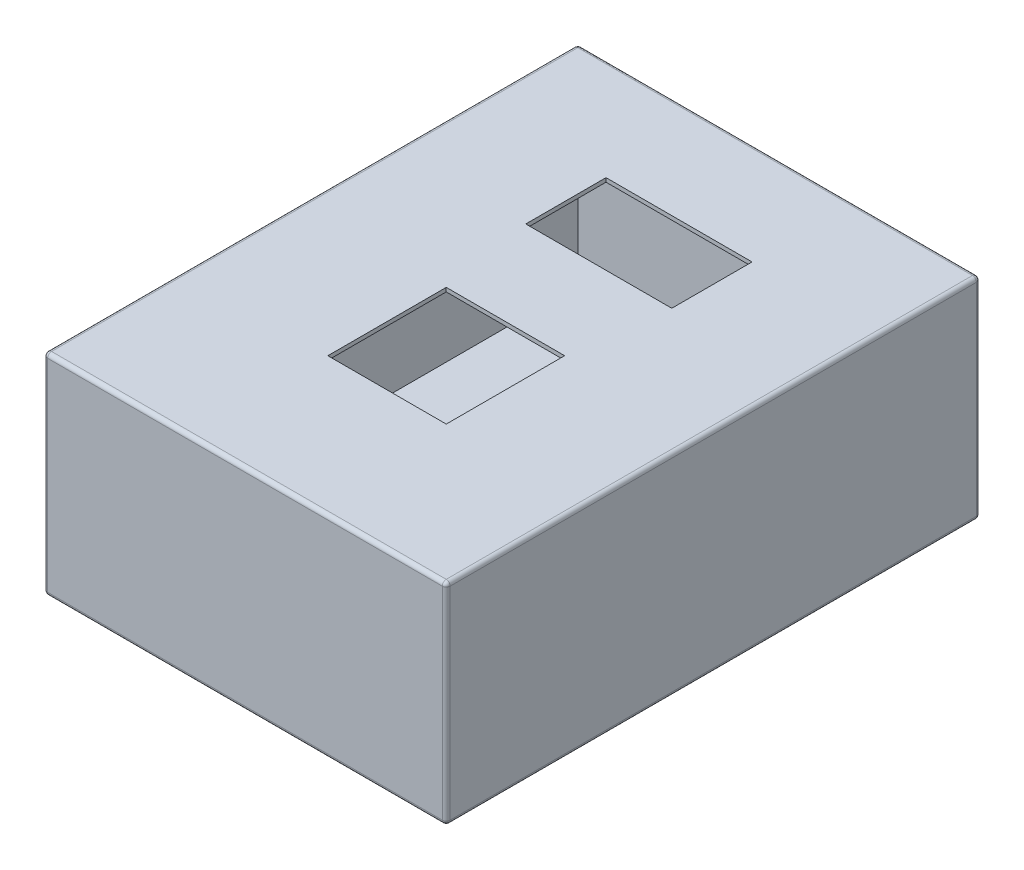
ISO-10303-21;
HEADER;
FILE_DESCRIPTION(('STEP AP214'),'2;1');
FILE_NAME('part.step','',(''),(''),'','','');
FILE_SCHEMA(('AUTOMOTIVE_DESIGN { 1 0 10303 214 1 1 1 1 }'));
ENDSEC;
DATA;
#1=APPLICATION_CONTEXT('core data for automotive mechanical design processes');
#2=APPLICATION_PROTOCOL_DEFINITION('international standard','automotive_design',2000,#1);
#3=PRODUCT_CONTEXT('',#1,'mechanical');
#4=PRODUCT('Part','Part','',(#3));
#5=PRODUCT_RELATED_PRODUCT_CATEGORY('part','',(#4));
#6=PRODUCT_DEFINITION_FORMATION('','',#4);
#7=PRODUCT_DEFINITION_CONTEXT('part definition',#1,'design');
#8=PRODUCT_DEFINITION('design','',#6,#7);
#9=PRODUCT_DEFINITION_SHAPE('','',#8);
#10=(LENGTH_UNIT() NAMED_UNIT(*) SI_UNIT(.MILLI.,.METRE.));
#11=(NAMED_UNIT(*) PLANE_ANGLE_UNIT() SI_UNIT($,.RADIAN.));
#12=(NAMED_UNIT(*) SI_UNIT($,.STERADIAN.) SOLID_ANGLE_UNIT());
#13=UNCERTAINTY_MEASURE_WITH_UNIT(LENGTH_MEASURE(1.E-05),#10,'distance_accuracy_value','');
#14=(GEOMETRIC_REPRESENTATION_CONTEXT(3) GLOBAL_UNCERTAINTY_ASSIGNED_CONTEXT((#13)) GLOBAL_UNIT_ASSIGNED_CONTEXT((#10,
#11,#12)) REPRESENTATION_CONTEXT('',''));
#15=CARTESIAN_POINT('',(0.,0.,0.));
#16=DIRECTION('',(0.,0.,1.));
#17=DIRECTION('',(1.,0.,0.));
#18=AXIS2_PLACEMENT_3D('',#15,#16,#17);
#19=CARTESIAN_POINT('',(1941.20140895498,157.,2493.15201015672));
#20=DIRECTION('',(1.,0.,0.));
#21=DIRECTION('',(0.,0.,-1.));
#22=AXIS2_PLACEMENT_3D('',#19,#20,#21);
#23=PLANE('',#22);
#24=DIRECTION('',(0.,0.,1.));
#25=VECTOR('',#24,1.);
#26=CARTESIAN_POINT('',(1941.20140895498,3.,2493.15201015672));
#27=LINE('',#26,#25);
#28=CARTESIAN_POINT('',(1941.20140895498,3.,2493.15201015672));
#29=VERTEX_POINT('',#28);
#30=CARTESIAN_POINT('',(1941.20140895498,3.,2893.15201015672));
#31=VERTEX_POINT('',#30);
#32=EDGE_CURVE('E284',#29,#31,#27,.T.);
#33=ORIENTED_EDGE('',*,*,#32,.F.);
#34=DIRECTION('',(0.,-1.,0.));
#35=VECTOR('',#34,1.);
#36=CARTESIAN_POINT('',(1941.20140895498,157.,2493.15201015672));
#37=LINE('',#36,#35);
#38=CARTESIAN_POINT('',(1941.20140895498,157.,2493.15201015672));
#39=VERTEX_POINT('',#38);
#40=EDGE_CURVE('E299',#39,#29,#37,.T.);
#41=ORIENTED_EDGE('',*,*,#40,.F.);
#42=DIRECTION('',(0.,0.,1.));
#43=VECTOR('',#42,1.);
#44=CARTESIAN_POINT('',(1941.20140895498,157.,2493.15201015672));
#45=LINE('',#44,#43);
#46=CARTESIAN_POINT('',(1941.20140895498,157.,2893.15201015672));
#47=VERTEX_POINT('',#46);
#48=EDGE_CURVE('E285',#39,#47,#45,.T.);
#49=ORIENTED_EDGE('',*,*,#48,.T.);
#50=DIRECTION('',(0.,-1.,0.));
#51=VECTOR('',#50,1.);
#52=CARTESIAN_POINT('',(1941.20140895498,157.,2893.15201015672));
#53=LINE('',#52,#51);
#54=EDGE_CURVE('E322',#47,#31,#53,.T.);
#55=ORIENTED_EDGE('',*,*,#54,.T.);
#56=EDGE_LOOP('',(#33,#41,#49,#55));
#57=FACE_BOUND('',#56,.T.);
#58=ADVANCED_FACE('F43',(#57),#23,.T.);
#59=CARTESIAN_POINT('',(1941.20140895498,157.,2893.15201015672));
#60=DIRECTION('',(0.,0.,-1.));
#61=DIRECTION('',(-1.,0.,0.));
#62=AXIS2_PLACEMENT_3D('',#59,#60,#61);
#63=PLANE('',#62);
#64=DIRECTION('',(1.,0.,0.));
#65=VECTOR('',#64,1.);
#66=CARTESIAN_POINT('',(1941.20140895498,3.,2893.15201015672));
#67=LINE('',#66,#65);
#68=CARTESIAN_POINT('',(2241.20140895498,3.,2893.15201015672));
#69=VERTEX_POINT('',#68);
#70=EDGE_CURVE('E303',#31,#69,#67,.T.);
#71=ORIENTED_EDGE('',*,*,#70,.F.);
#72=ORIENTED_EDGE('',*,*,#54,.F.);
#73=DIRECTION('',(1.,0.,0.));
#74=VECTOR('',#73,1.);
#75=CARTESIAN_POINT('',(1941.20140895498,157.,2893.15201015672));
#76=LINE('',#75,#74);
#77=CARTESIAN_POINT('',(2241.20140895498,157.,2893.15201015672));
#78=VERTEX_POINT('',#77);
#79=EDGE_CURVE('E289',#47,#78,#76,.T.);
#80=ORIENTED_EDGE('',*,*,#79,.T.);
#81=DIRECTION('',(0.,-1.,0.));
#82=VECTOR('',#81,1.);
#83=CARTESIAN_POINT('',(2241.20140895498,157.,2893.15201015672));
#84=LINE('',#83,#82);
#85=EDGE_CURVE('E318',#78,#69,#84,.T.);
#86=ORIENTED_EDGE('',*,*,#85,.T.);
#87=EDGE_LOOP('',(#71,#72,#80,#86));
#88=FACE_BOUND('',#87,.T.);
#89=ADVANCED_FACE('F597',(#88),#63,.T.);
#90=CARTESIAN_POINT('',(2241.20140895498,157.,2493.15201015672));
#91=DIRECTION('',(-1.,0.,0.));
#92=DIRECTION('',(0.,0.,1.));
#93=AXIS2_PLACEMENT_3D('',#90,#91,#92);
#94=PLANE('',#93);
#95=DIRECTION('',(0.,0.,-1.));
#96=VECTOR('',#95,1.);
#97=CARTESIAN_POINT('',(2241.20140895498,3.,2493.15201015672));
#98=LINE('',#97,#96);
#99=CARTESIAN_POINT('',(2241.20140895498,3.,2493.15201015672));
#100=VERTEX_POINT('',#99);
#101=EDGE_CURVE('E306',#69,#100,#98,.T.);
#102=ORIENTED_EDGE('',*,*,#101,.F.);
#103=ORIENTED_EDGE('',*,*,#85,.F.);
#104=DIRECTION('',(0.,0.,-1.));
#105=VECTOR('',#104,1.);
#106=CARTESIAN_POINT('',(2241.20140895498,157.,2493.15201015672));
#107=LINE('',#106,#105);
#108=CARTESIAN_POINT('',(2241.20140895498,157.,2493.15201015672));
#109=VERTEX_POINT('',#108);
#110=EDGE_CURVE('E293',#78,#109,#107,.T.);
#111=ORIENTED_EDGE('',*,*,#110,.T.);
#112=DIRECTION('',(0.,-1.,0.));
#113=VECTOR('',#112,1.);
#114=CARTESIAN_POINT('',(2241.20140895498,157.,2493.15201015672));
#115=LINE('',#114,#113);
#116=EDGE_CURVE('E314',#109,#100,#115,.T.);
#117=ORIENTED_EDGE('',*,*,#116,.T.);
#118=EDGE_LOOP('',(#102,#103,#111,#117));
#119=FACE_BOUND('',#118,.T.);
#120=ADVANCED_FACE('F603',(#119),#94,.T.);
#121=CARTESIAN_POINT('',(1941.20140895498,157.,2493.15201015672));
#122=DIRECTION('',(0.,0.,1.));
#123=DIRECTION('',(1.,0.,0.));
#124=AXIS2_PLACEMENT_3D('',#121,#122,#123);
#125=PLANE('',#124);
#126=DIRECTION('',(-1.,0.,0.));
#127=VECTOR('',#126,1.);
#128=CARTESIAN_POINT('',(1941.20140895498,3.,2493.15201015672));
#129=LINE('',#128,#127);
#130=EDGE_CURVE('E290',#100,#29,#129,.T.);
#131=ORIENTED_EDGE('',*,*,#130,.F.);
#132=ORIENTED_EDGE('',*,*,#116,.F.);
#133=DIRECTION('',(-1.,0.,0.));
#134=VECTOR('',#133,1.);
#135=CARTESIAN_POINT('',(1941.20140895498,157.,2493.15201015672));
#136=LINE('',#135,#134);
#137=EDGE_CURVE('E296',#109,#39,#136,.T.);
#138=ORIENTED_EDGE('',*,*,#137,.T.);
#139=ORIENTED_EDGE('',*,*,#40,.T.);
#140=EDGE_LOOP('',(#131,#132,#138,#139));
#141=FACE_BOUND('',#140,.T.);
#142=ADVANCED_FACE('F872',(#141),#125,.T.);
#143=CARTESIAN_POINT('',(0.,157.,0.));
#144=DIRECTION('',(0.,1.,0.));
#145=DIRECTION('',(0.,0.,1.));
#146=AXIS2_PLACEMENT_3D('',#143,#144,#145);
#147=PLANE('',#146);
#148=DIRECTION('',(-1.,0.,0.));
#149=VECTOR('',#148,1.);
#150=CARTESIAN_POINT('',(0.,157.,2700.94512117278));
#151=LINE('',#150,#149);
#152=CARTESIAN_POINT('',(2139.01111828185,157.,2700.94512117278));
#153=VERTEX_POINT('',#152);
#154=CARTESIAN_POINT('',(2049.01111828185,157.,2700.94512117278));
#155=VERTEX_POINT('',#154);
#156=EDGE_CURVE('E246',#153,#155,#151,.T.);
#157=ORIENTED_EDGE('',*,*,#156,.T.);
#158=DIRECTION('',(0.,0.,1.));
#159=VECTOR('',#158,1.);
#160=CARTESIAN_POINT('',(2049.01111828185,157.,0.));
#161=LINE('',#160,#159);
#162=CARTESIAN_POINT('',(2049.01111828185,157.,2790.94512117278));
#163=VERTEX_POINT('',#162);
#164=EDGE_CURVE('E250',#155,#163,#161,.T.);
#165=ORIENTED_EDGE('',*,*,#164,.T.);
#166=DIRECTION('',(1.,0.,0.));
#167=VECTOR('',#166,1.);
#168=CARTESIAN_POINT('',(0.,157.,2790.94512117278));
#169=LINE('',#168,#167);
#170=CARTESIAN_POINT('',(2139.01111828185,157.,2790.94512117278));
#171=VERTEX_POINT('',#170);
#172=EDGE_CURVE('E237',#163,#171,#169,.T.);
#173=ORIENTED_EDGE('',*,*,#172,.T.);
#174=DIRECTION('',(0.,0.,-1.));
#175=VECTOR('',#174,1.);
#176=CARTESIAN_POINT('',(2139.01111828185,157.,0.));
#177=LINE('',#176,#175);
#178=EDGE_CURVE('E212',#171,#153,#177,.T.);
#179=ORIENTED_EDGE('',*,*,#178,.T.);
#180=EDGE_LOOP('',(#157,#165,#173,#179));
#181=FACE_BOUND('',#180,.T.);
#182=DIRECTION('',(0.,0.,-1.));
#183=VECTOR('',#182,1.);
#184=CARTESIAN_POINT('',(2148.50217899265,157.,0.));
#185=LINE('',#184,#183);
#186=CARTESIAN_POINT('',(2148.50217899265,157.,2628.98312793191));
#187=VERTEX_POINT('',#186);
#188=CARTESIAN_POINT('',(2148.50217899265,157.,2567.98312793191));
#189=VERTEX_POINT('',#188);
#190=EDGE_CURVE('E326',#187,#189,#185,.T.);
#191=ORIENTED_EDGE('',*,*,#190,.T.);
#192=DIRECTION('',(-1.,0.,0.));
#193=VECTOR('',#192,1.);
#194=CARTESIAN_POINT('',(0.,157.,2567.98312793191));
#195=LINE('',#194,#193);
#196=CARTESIAN_POINT('',(2037.50217899265,157.,2567.98312793191));
#197=VERTEX_POINT('',#196);
#198=EDGE_CURVE('E338',#189,#197,#195,.T.);
#199=ORIENTED_EDGE('',*,*,#198,.T.);
#200=DIRECTION('',(0.,0.,1.));
#201=VECTOR('',#200,1.);
#202=CARTESIAN_POINT('',(2037.50217899265,157.,0.));
#203=LINE('',#202,#201);
#204=CARTESIAN_POINT('',(2037.50217899265,157.,2628.98312793191));
#205=VERTEX_POINT('',#204);
#206=EDGE_CURVE('E334',#197,#205,#203,.T.);
#207=ORIENTED_EDGE('',*,*,#206,.T.);
#208=DIRECTION('',(1.,0.,0.));
#209=VECTOR('',#208,1.);
#210=CARTESIAN_POINT('',(0.,157.,2628.98312793191));
#211=LINE('',#210,#209);
#212=EDGE_CURVE('E330',#205,#187,#211,.T.);
#213=ORIENTED_EDGE('',*,*,#212,.T.);
#214=EDGE_LOOP('',(#191,#199,#207,#213));
#215=FACE_BOUND('',#214,.T.);
#216=ORIENTED_EDGE('',*,*,#48,.F.);
#217=ORIENTED_EDGE('',*,*,#137,.F.);
#218=ORIENTED_EDGE('',*,*,#110,.F.);
#219=ORIENTED_EDGE('',*,*,#79,.F.);
#220=EDGE_LOOP('',(#216,#217,#218,#219));
#221=FACE_BOUND('',#220,.T.);
#222=ADVANCED_FACE('F863',(#181,#215,#221),#147,.F.);
#223=CARTESIAN_POINT('',(0.,3.,0.));
#224=DIRECTION('',(0.,1.,0.));
#225=DIRECTION('',(0.,0.,1.));
#226=AXIS2_PLACEMENT_3D('',#223,#224,#225);
#227=PLANE('',#226);
#228=ORIENTED_EDGE('',*,*,#32,.T.);
#229=ORIENTED_EDGE('',*,*,#70,.T.);
#230=ORIENTED_EDGE('',*,*,#101,.T.);
#231=ORIENTED_EDGE('',*,*,#130,.T.);
#232=EDGE_LOOP('',(#228,#229,#230,#231));
#233=FACE_BOUND('',#232,.T.);
#234=ADVANCED_FACE('F854',(#233),#227,.T.);
#235=CARTESIAN_POINT('',(2037.50217899265,165.,2567.98312793191));
#236=DIRECTION('',(0.,0.,-1.));
#237=DIRECTION('',(-1.,0.,0.));
#238=AXIS2_PLACEMENT_3D('',#235,#236,#237);
#239=PLANE('',#238);
#240=DIRECTION('',(-1.,0.,0.));
#241=VECTOR('',#240,1.);
#242=CARTESIAN_POINT('',(0.,160.,2567.98312793191));
#243=LINE('',#242,#241);
#244=CARTESIAN_POINT('',(2148.50217899265,160.,2567.98312793191));
#245=VERTEX_POINT('',#244);
#246=CARTESIAN_POINT('',(2037.50217899265,160.,2567.98312793191));
#247=VERTEX_POINT('',#246);
#248=EDGE_CURVE('E281',#245,#247,#243,.T.);
#249=ORIENTED_EDGE('',*,*,#248,.T.);
#250=DIRECTION('',(0.,-1.,0.));
#251=VECTOR('',#250,1.);
#252=CARTESIAN_POINT('',(2037.50217899265,165.,2567.98312793191));
#253=LINE('',#252,#251);
#254=EDGE_CURVE('E255',#247,#197,#253,.T.);
#255=ORIENTED_EDGE('',*,*,#254,.T.);
#256=ORIENTED_EDGE('',*,*,#198,.F.);
#257=DIRECTION('',(0.,-1.,0.));
#258=VECTOR('',#257,1.);
#259=CARTESIAN_POINT('',(2148.50217899265,165.,2567.98312793191));
#260=LINE('',#259,#258);
#261=EDGE_CURVE('E268',#245,#189,#260,.T.);
#262=ORIENTED_EDGE('',*,*,#261,.F.);
#263=EDGE_LOOP('',(#249,#255,#256,#262));
#264=FACE_BOUND('',#263,.T.);
#265=ADVANCED_FACE('F845',(#264),#239,.F.);
#266=CARTESIAN_POINT('',(2037.50217899265,165.,2628.98312793191));
#267=DIRECTION('',(-1.,0.,0.));
#268=DIRECTION('',(0.,0.,1.));
#269=AXIS2_PLACEMENT_3D('',#266,#267,#268);
#270=PLANE('',#269);
#271=DIRECTION('',(0.,0.,1.));
#272=VECTOR('',#271,1.);
#273=CARTESIAN_POINT('',(2037.50217899265,160.,0.));
#274=LINE('',#273,#272);
#275=CARTESIAN_POINT('',(2037.50217899265,160.,2628.98312793191));
#276=VERTEX_POINT('',#275);
#277=EDGE_CURVE('E278',#247,#276,#274,.T.);
#278=ORIENTED_EDGE('',*,*,#277,.T.);
#279=DIRECTION('',(0.,-1.,0.));
#280=VECTOR('',#279,1.);
#281=CARTESIAN_POINT('',(2037.50217899265,165.,2628.98312793191));
#282=LINE('',#281,#280);
#283=EDGE_CURVE('E260',#276,#205,#282,.T.);
#284=ORIENTED_EDGE('',*,*,#283,.T.);
#285=ORIENTED_EDGE('',*,*,#206,.F.);
#286=ORIENTED_EDGE('',*,*,#254,.F.);
#287=EDGE_LOOP('',(#278,#284,#285,#286));
#288=FACE_BOUND('',#287,.T.);
#289=ADVANCED_FACE('F836',(#288),#270,.F.);
#290=CARTESIAN_POINT('',(2148.50217899265,165.,2628.98312793191));
#291=DIRECTION('',(0.,0.,1.));
#292=DIRECTION('',(1.,0.,0.));
#293=AXIS2_PLACEMENT_3D('',#290,#291,#292);
#294=PLANE('',#293);
#295=DIRECTION('',(1.,0.,0.));
#296=VECTOR('',#295,1.);
#297=CARTESIAN_POINT('',(0.,160.,2628.98312793191));
#298=LINE('',#297,#296);
#299=CARTESIAN_POINT('',(2148.50217899265,160.,2628.98312793191));
#300=VERTEX_POINT('',#299);
#301=EDGE_CURVE('E274',#276,#300,#298,.T.);
#302=ORIENTED_EDGE('',*,*,#301,.T.);
#303=DIRECTION('',(0.,-1.,0.));
#304=VECTOR('',#303,1.);
#305=CARTESIAN_POINT('',(2148.50217899265,165.,2628.98312793191));
#306=LINE('',#305,#304);
#307=EDGE_CURVE('E264',#300,#187,#306,.T.);
#308=ORIENTED_EDGE('',*,*,#307,.T.);
#309=ORIENTED_EDGE('',*,*,#212,.F.);
#310=ORIENTED_EDGE('',*,*,#283,.F.);
#311=EDGE_LOOP('',(#302,#308,#309,#310));
#312=FACE_BOUND('',#311,.T.);
#313=ADVANCED_FACE('F827',(#312),#294,.F.);
#314=CARTESIAN_POINT('',(2148.50217899265,165.,2567.98312793191));
#315=DIRECTION('',(1.,0.,0.));
#316=DIRECTION('',(0.,0.,-1.));
#317=AXIS2_PLACEMENT_3D('',#314,#315,#316);
#318=PLANE('',#317);
#319=DIRECTION('',(0.,0.,-1.));
#320=VECTOR('',#319,1.);
#321=CARTESIAN_POINT('',(2148.50217899265,160.,0.));
#322=LINE('',#321,#320);
#323=EDGE_CURVE('E259',#300,#245,#322,.T.);
#324=ORIENTED_EDGE('',*,*,#323,.T.);
#325=ORIENTED_EDGE('',*,*,#261,.T.);
#326=ORIENTED_EDGE('',*,*,#190,.F.);
#327=ORIENTED_EDGE('',*,*,#307,.F.);
#328=EDGE_LOOP('',(#324,#325,#326,#327));
#329=FACE_BOUND('',#328,.T.);
#330=ADVANCED_FACE('F623',(#329),#318,.F.);
#331=CARTESIAN_POINT('',(1938.20140895498,160.,2493.15201015672));
#332=DIRECTION('',(1.,0.,0.));
#333=DIRECTION('',(0.,0.,-1.));
#334=AXIS2_PLACEMENT_3D('',#331,#332,#333);
#335=PLANE('',#334);
#336=DIRECTION('',(0.,-1.,0.));
#337=VECTOR('',#336,1.);
#338=CARTESIAN_POINT('',(1938.20140895498,160.,2493.15201015672));
#339=LINE('',#338,#337);
#340=CARTESIAN_POINT('',(1938.20140895498,157.,2493.15201015672));
#341=VERTEX_POINT('',#340);
#342=CARTESIAN_POINT('',(1938.20140895498,3.,2493.15201015672));
#343=VERTEX_POINT('',#342);
#344=EDGE_CURVE('E357',#341,#343,#339,.T.);
#345=ORIENTED_EDGE('',*,*,#344,.T.);
#346=DIRECTION('',(0.,0.,1.));
#347=VECTOR('',#346,1.);
#348=CARTESIAN_POINT('',(1938.20140895498,3.,2493.15201015672));
#349=LINE('',#348,#347);
#350=CARTESIAN_POINT('',(1938.20140895498,3.,2893.15201015672));
#351=VERTEX_POINT('',#350);
#352=EDGE_CURVE('E411',#343,#351,#349,.T.);
#353=ORIENTED_EDGE('',*,*,#352,.T.);
#354=DIRECTION('',(0.,-1.,0.));
#355=VECTOR('',#354,1.);
#356=CARTESIAN_POINT('',(1938.20140895498,160.,2893.15201015672));
#357=LINE('',#356,#355);
#358=CARTESIAN_POINT('',(1938.20140895498,157.,2893.15201015672));
#359=VERTEX_POINT('',#358);
#360=EDGE_CURVE('E361',#351,#359,#357,.F.);
#361=ORIENTED_EDGE('',*,*,#360,.T.);
#362=DIRECTION('',(0.,0.,1.));
#363=VECTOR('',#362,1.);
#364=CARTESIAN_POINT('',(1938.20140895498,157.,2490.15201015672));
#365=LINE('',#364,#363);
#366=EDGE_CURVE('E346',#359,#341,#365,.F.);
#367=ORIENTED_EDGE('',*,*,#366,.T.);
#368=EDGE_LOOP('',(#345,#353,#361,#367));
#369=FACE_BOUND('',#368,.T.);
#370=ADVANCED_FACE('F557',(#369),#335,.F.);
#371=CARTESIAN_POINT('',(1941.20140895498,160.,2896.15201015672));
#372=DIRECTION('',(0.,0.,-1.));
#373=DIRECTION('',(-1.,0.,0.));
#374=AXIS2_PLACEMENT_3D('',#371,#372,#373);
#375=PLANE('',#374);
#376=DIRECTION('',(0.,-1.,0.));
#377=VECTOR('',#376,1.);
#378=CARTESIAN_POINT('',(1941.20140895498,160.,2896.15201015672));
#379=LINE('',#378,#377);
#380=CARTESIAN_POINT('',(1941.20140895498,157.,2896.15201015672));
#381=VERTEX_POINT('',#380);
#382=CARTESIAN_POINT('',(1941.20140895498,3.,2896.15201015672));
#383=VERTEX_POINT('',#382);
#384=EDGE_CURVE('E353',#381,#383,#379,.T.);
#385=ORIENTED_EDGE('',*,*,#384,.T.);
#386=DIRECTION('',(1.,0.,0.));
#387=VECTOR('',#386,1.);
#388=CARTESIAN_POINT('',(1941.20140895498,3.,2896.15201015672));
#389=LINE('',#388,#387);
#390=CARTESIAN_POINT('',(2241.20140895498,3.,2896.15201015672));
#391=VERTEX_POINT('',#390);
#392=EDGE_CURVE('E451',#383,#391,#389,.T.);
#393=ORIENTED_EDGE('',*,*,#392,.T.);
#394=DIRECTION('',(0.,-1.,0.));
#395=VECTOR('',#394,1.);
#396=CARTESIAN_POINT('',(2241.20140895498,160.,2896.15201015672));
#397=LINE('',#396,#395);
#398=CARTESIAN_POINT('',(2241.20140895498,157.,2896.15201015672));
#399=VERTEX_POINT('',#398);
#400=EDGE_CURVE('E448',#391,#399,#397,.F.);
#401=ORIENTED_EDGE('',*,*,#400,.T.);
#402=DIRECTION('',(1.,0.,0.));
#403=VECTOR('',#402,1.);
#404=CARTESIAN_POINT('',(1941.20140895498,157.,2896.15201015672));
#405=LINE('',#404,#403);
#406=EDGE_CURVE('E350',#399,#381,#405,.F.);
#407=ORIENTED_EDGE('',*,*,#406,.T.);
#408=EDGE_LOOP('',(#385,#393,#401,#407));
#409=FACE_BOUND('',#408,.T.);
#410=ADVANCED_FACE('F569',(#409),#375,.F.);
#411=CARTESIAN_POINT('',(2244.20140895498,160.,2493.15201015672));
#412=DIRECTION('',(-1.,0.,0.));
#413=DIRECTION('',(0.,0.,1.));
#414=AXIS2_PLACEMENT_3D('',#411,#412,#413);
#415=PLANE('',#414);
#416=DIRECTION('',(0.,0.,-1.));
#417=VECTOR('',#416,1.);
#418=CARTESIAN_POINT('',(2244.20140895498,3.,2493.15201015672));
#419=LINE('',#418,#417);
#420=CARTESIAN_POINT('',(2244.20140895498,3.,2893.15201015672));
#421=VERTEX_POINT('',#420);
#422=CARTESIAN_POINT('',(2244.20140895498,3.,2493.15201015672));
#423=VERTEX_POINT('',#422);
#424=EDGE_CURVE('E53',#421,#423,#419,.T.);
#425=ORIENTED_EDGE('',*,*,#424,.T.);
#426=DIRECTION('',(0.,-1.,0.));
#427=VECTOR('',#426,1.);
#428=CARTESIAN_POINT('',(2244.20140895498,160.,2493.15201015672));
#429=LINE('',#428,#427);
#430=CARTESIAN_POINT('',(2244.20140895498,157.,2493.15201015672));
#431=VERTEX_POINT('',#430);
#432=EDGE_CURVE('E11',#423,#431,#429,.F.);
#433=ORIENTED_EDGE('',*,*,#432,.T.);
#434=DIRECTION('',(0.,0.,-1.));
#435=VECTOR('',#434,1.);
#436=CARTESIAN_POINT('',(2244.20140895498,157.,2896.15201015672));
#437=LINE('',#436,#435);
#438=CARTESIAN_POINT('',(2244.20140895498,157.,2893.15201015672));
#439=VERTEX_POINT('',#438);
#440=EDGE_CURVE('E388',#431,#439,#437,.F.);
#441=ORIENTED_EDGE('',*,*,#440,.T.);
#442=DIRECTION('',(0.,-1.,0.));
#443=VECTOR('',#442,1.);
#444=CARTESIAN_POINT('',(2244.20140895498,160.,2893.15201015672));
#445=LINE('',#444,#443);
#446=EDGE_CURVE('E454',#439,#421,#445,.T.);
#447=ORIENTED_EDGE('',*,*,#446,.T.);
#448=EDGE_LOOP('',(#425,#433,#441,#447));
#449=FACE_BOUND('',#448,.T.);
#450=ADVANCED_FACE('F615',(#449),#415,.F.);
#451=CARTESIAN_POINT('',(1941.20140895498,160.,2490.15201015672));
#452=DIRECTION('',(0.,0.,1.));
#453=DIRECTION('',(1.,0.,0.));
#454=AXIS2_PLACEMENT_3D('',#451,#452,#453);
#455=PLANE('',#454);
#456=DIRECTION('',(0.,-1.,0.));
#457=VECTOR('',#456,1.);
#458=CARTESIAN_POINT('',(2241.20140895498,160.,2490.15201015672));
#459=LINE('',#458,#457);
#460=CARTESIAN_POINT('',(2241.20140895498,157.,2490.15201015672));
#461=VERTEX_POINT('',#460);
#462=CARTESIAN_POINT('',(2241.20140895498,3.,2490.15201015672));
#463=VERTEX_POINT('',#462);
#464=EDGE_CURVE('E442',#461,#463,#459,.T.);
#465=ORIENTED_EDGE('',*,*,#464,.T.);
#466=DIRECTION('',(-1.,0.,0.));
#467=VECTOR('',#466,1.);
#468=CARTESIAN_POINT('',(1941.20140895498,3.,2490.15201015672));
#469=LINE('',#468,#467);
#470=CARTESIAN_POINT('',(1941.20140895498,3.,2490.15201015672));
#471=VERTEX_POINT('',#470);
#472=EDGE_CURVE('E445',#463,#471,#469,.T.);
#473=ORIENTED_EDGE('',*,*,#472,.T.);
#474=DIRECTION('',(0.,-1.,0.));
#475=VECTOR('',#474,1.);
#476=CARTESIAN_POINT('',(1941.20140895498,160.,2490.15201015672));
#477=LINE('',#476,#475);
#478=CARTESIAN_POINT('',(1941.20140895498,157.,2490.15201015672));
#479=VERTEX_POINT('',#478);
#480=EDGE_CURVE('E374',#471,#479,#477,.F.);
#481=ORIENTED_EDGE('',*,*,#480,.T.);
#482=DIRECTION('',(-1.,0.,0.));
#483=VECTOR('',#482,1.);
#484=CARTESIAN_POINT('',(2244.20140895498,157.,2490.15201015672));
#485=LINE('',#484,#483);
#486=EDGE_CURVE('E370',#479,#461,#485,.F.);
#487=ORIENTED_EDGE('',*,*,#486,.T.);
#488=EDGE_LOOP('',(#465,#473,#481,#487));
#489=FACE_BOUND('',#488,.T.);
#490=ADVANCED_FACE('F537',(#489),#455,.F.);
#491=CARTESIAN_POINT('',(0.,160.,0.));
#492=DIRECTION('',(0.,1.,0.));
#493=DIRECTION('',(0.,0.,1.));
#494=AXIS2_PLACEMENT_3D('',#491,#492,#493);
#495=PLANE('',#494);
#496=DIRECTION('',(0.,0.,1.));
#497=VECTOR('',#496,1.);
#498=CARTESIAN_POINT('',(2049.01111828185,160.,2700.94512117278));
#499=LINE('',#498,#497);
#500=CARTESIAN_POINT('',(2049.01111828185,160.,2700.94512117278));
#501=VERTEX_POINT('',#500);
#502=CARTESIAN_POINT('',(2049.01111828185,160.,2790.94512117278));
#503=VERTEX_POINT('',#502);
#504=EDGE_CURVE('E69',#501,#503,#499,.T.);
#505=ORIENTED_EDGE('',*,*,#504,.F.);
#506=DIRECTION('',(-1.,0.,0.));
#507=VECTOR('',#506,1.);
#508=CARTESIAN_POINT('',(2049.01111828185,160.,2700.94512117278));
#509=LINE('',#508,#507);
#510=CARTESIAN_POINT('',(2139.01111828185,160.,2700.94512117278));
#511=VERTEX_POINT('',#510);
#512=EDGE_CURVE('E227',#511,#501,#509,.T.);
#513=ORIENTED_EDGE('',*,*,#512,.F.);
#514=DIRECTION('',(0.,0.,-1.));
#515=VECTOR('',#514,1.);
#516=CARTESIAN_POINT('',(2139.01111828185,160.,2700.94512117278));
#517=LINE('',#516,#515);
#518=CARTESIAN_POINT('',(2139.01111828185,160.,2790.94512117278));
#519=VERTEX_POINT('',#518);
#520=EDGE_CURVE('E209',#519,#511,#517,.T.);
#521=ORIENTED_EDGE('',*,*,#520,.F.);
#522=DIRECTION('',(1.,0.,0.));
#523=VECTOR('',#522,1.);
#524=CARTESIAN_POINT('',(2049.01111828185,160.,2790.94512117278));
#525=LINE('',#524,#523);
#526=EDGE_CURVE('E219',#503,#519,#525,.T.);
#527=ORIENTED_EDGE('',*,*,#526,.F.);
#528=EDGE_LOOP('',(#505,#513,#521,#527));
#529=FACE_BOUND('',#528,.T.);
#530=ORIENTED_EDGE('',*,*,#248,.F.);
#531=ORIENTED_EDGE('',*,*,#323,.F.);
#532=ORIENTED_EDGE('',*,*,#301,.F.);
#533=ORIENTED_EDGE('',*,*,#277,.F.);
#534=EDGE_LOOP('',(#530,#531,#532,#533));
#535=FACE_BOUND('',#534,.T.);
#536=DIRECTION('',(0.,0.,1.));
#537=VECTOR('',#536,1.);
#538=CARTESIAN_POINT('',(1941.20140895498,160.,2896.15201015672));
#539=LINE('',#538,#537);
#540=CARTESIAN_POINT('',(1941.20140895498,160.,2493.15201015672));
#541=VERTEX_POINT('',#540);
#542=CARTESIAN_POINT('',(1941.20140895498,160.,2893.15201015672));
#543=VERTEX_POINT('',#542);
#544=EDGE_CURVE('E342',#541,#543,#539,.T.);
#545=ORIENTED_EDGE('',*,*,#544,.T.);
#546=DIRECTION('',(1.,0.,0.));
#547=VECTOR('',#546,1.);
#548=CARTESIAN_POINT('',(2244.20140895498,160.,2893.15201015672));
#549=LINE('',#548,#547);
#550=CARTESIAN_POINT('',(2241.20140895498,160.,2893.15201015672));
#551=VERTEX_POINT('',#550);
#552=EDGE_CURVE('E384',#543,#551,#549,.T.);
#553=ORIENTED_EDGE('',*,*,#552,.T.);
#554=DIRECTION('',(0.,0.,-1.));
#555=VECTOR('',#554,1.);
#556=CARTESIAN_POINT('',(2241.20140895498,160.,2490.15201015672));
#557=LINE('',#556,#555);
#558=CARTESIAN_POINT('',(2241.20140895498,160.,2493.15201015672));
#559=VERTEX_POINT('',#558);
#560=EDGE_CURVE('E380',#551,#559,#557,.T.);
#561=ORIENTED_EDGE('',*,*,#560,.T.);
#562=DIRECTION('',(-1.,0.,0.));
#563=VECTOR('',#562,1.);
#564=CARTESIAN_POINT('',(1941.20140895498,160.,2493.15201015672));
#565=LINE('',#564,#563);
#566=EDGE_CURVE('E377',#559,#541,#565,.T.);
#567=ORIENTED_EDGE('',*,*,#566,.T.);
#568=EDGE_LOOP('',(#545,#553,#561,#567));
#569=FACE_BOUND('',#568,.T.);
#570=ADVANCED_FACE('F224',(#529,#535,#569),#495,.T.);
#571=CARTESIAN_POINT('',(0.,0.,0.));
#572=DIRECTION('',(0.,1.,0.));
#573=DIRECTION('',(0.,0.,1.));
#574=AXIS2_PLACEMENT_3D('',#571,#572,#573);
#575=PLANE('',#574);
#576=DIRECTION('',(1.,0.,0.));
#577=VECTOR('',#576,1.);
#578=CARTESIAN_POINT('',(0.,0.,2893.15201015672));
#579=LINE('',#578,#577);
#580=CARTESIAN_POINT('',(2241.20140895498,0.,2893.15201015672));
#581=VERTEX_POINT('',#580);
#582=CARTESIAN_POINT('',(1941.20140895498,0.,2893.15201015672));
#583=VERTEX_POINT('',#582);
#584=EDGE_CURVE('E417',#581,#583,#579,.F.);
#585=ORIENTED_EDGE('',*,*,#584,.T.);
#586=DIRECTION('',(0.,0.,1.));
#587=VECTOR('',#586,1.);
#588=CARTESIAN_POINT('',(1941.20140895498,0.,0.));
#589=LINE('',#588,#587);
#590=CARTESIAN_POINT('',(1941.20140895498,0.,2493.15201015672));
#591=VERTEX_POINT('',#590);
#592=EDGE_CURVE('E423',#583,#591,#589,.F.);
#593=ORIENTED_EDGE('',*,*,#592,.T.);
#594=DIRECTION('',(-1.,0.,0.));
#595=VECTOR('',#594,1.);
#596=CARTESIAN_POINT('',(0.,0.,2493.15201015672));
#597=LINE('',#596,#595);
#598=CARTESIAN_POINT('',(2241.20140895498,0.,2493.15201015672));
#599=VERTEX_POINT('',#598);
#600=EDGE_CURVE('E420',#591,#599,#597,.F.);
#601=ORIENTED_EDGE('',*,*,#600,.T.);
#602=DIRECTION('',(0.,0.,-1.));
#603=VECTOR('',#602,1.);
#604=CARTESIAN_POINT('',(2241.20140895498,0.,2.48823340704416E-12));
#605=LINE('',#604,#603);
#606=EDGE_CURVE('E414',#599,#581,#605,.F.);
#607=ORIENTED_EDGE('',*,*,#606,.T.);
#608=EDGE_LOOP('',(#585,#593,#601,#607));
#609=FACE_BOUND('',#608,.T.);
#610=ADVANCED_FACE('F583',(#609),#575,.F.);
#611=CARTESIAN_POINT('',(1941.20140895498,157.,0.));
#612=DIRECTION('',(0.,0.,-1.));
#613=DIRECTION('',(-1.,0.,0.));
#614=AXIS2_PLACEMENT_3D('',#611,#612,#613);
#615=CYLINDRICAL_SURFACE('',#614,3.);
#616=ORIENTED_EDGE('',*,*,#366,.F.);
#617=CARTESIAN_POINT('',(1941.20140895498,157.,2893.15201015672));
#618=DIRECTION('',(0.,0.,-1.));
#619=DIRECTION('',(-1.,0.,0.));
#620=AXIS2_PLACEMENT_3D('',#617,#618,#619);
#621=CIRCLE('',#620,3.);
#622=EDGE_CURVE('E367',#359,#543,#621,.T.);
#623=ORIENTED_EDGE('',*,*,#622,.T.);
#624=ORIENTED_EDGE('',*,*,#544,.F.);
#625=CARTESIAN_POINT('',(1941.20140895498,157.,2493.15201015672));
#626=DIRECTION('',(0.,0.,-1.));
#627=DIRECTION('',(-1.,0.,0.));
#628=AXIS2_PLACEMENT_3D('',#625,#626,#627);
#629=CIRCLE('',#628,3.);
#630=EDGE_CURVE('E364',#541,#341,#629,.F.);
#631=ORIENTED_EDGE('',*,*,#630,.T.);
#632=EDGE_LOOP('',(#616,#623,#624,#631));
#633=FACE_BOUND('',#632,.T.);
#634=ADVANCED_FACE('F548',(#633),#615,.T.);
#635=CARTESIAN_POINT('',(1941.20140895498,160.,2493.15201015672));
#636=DIRECTION('',(0.,-1.,0.));
#637=DIRECTION('',(0.,0.,-1.));
#638=AXIS2_PLACEMENT_3D('',#635,#636,#637);
#639=CYLINDRICAL_SURFACE('',#638,3.);
#640=ORIENTED_EDGE('',*,*,#480,.F.);
#641=CARTESIAN_POINT('',(1941.20140895498,3.,2493.15201015672));
#642=DIRECTION('',(0.,-1.,0.));
#643=DIRECTION('',(0.,0.,-1.));
#644=AXIS2_PLACEMENT_3D('',#641,#642,#643);
#645=CIRCLE('',#644,3.);
#646=EDGE_CURVE('E392',#471,#343,#645,.F.);
#647=ORIENTED_EDGE('',*,*,#646,.T.);
#648=ORIENTED_EDGE('',*,*,#344,.F.);
#649=CARTESIAN_POINT('',(1941.20140895498,157.,2493.15201015672));
#650=DIRECTION('',(0.,1.,0.));
#651=DIRECTION('',(0.,0.,1.));
#652=AXIS2_PLACEMENT_3D('',#649,#650,#651);
#653=CIRCLE('',#652,3.);
#654=EDGE_CURVE('E271',#479,#341,#653,.T.);
#655=ORIENTED_EDGE('',*,*,#654,.F.);
#656=EDGE_LOOP('',(#640,#647,#648,#655));
#657=FACE_BOUND('',#656,.T.);
#658=ADVANCED_FACE('F554',(#657),#639,.T.);
#659=CARTESIAN_POINT('',(1941.20140895498,157.,2493.15201015672));
#660=DIRECTION('',(0.,0.,1.));
#661=DIRECTION('',(1.,0.,0.));
#662=AXIS2_PLACEMENT_3D('',#659,#660,#661);
#663=SPHERICAL_SURFACE('',#662,3.);
#664=ORIENTED_EDGE('',*,*,#654,.T.);
#665=ORIENTED_EDGE('',*,*,#630,.F.);
#666=CARTESIAN_POINT('',(1941.20140895498,157.,2493.15201015672));
#667=DIRECTION('',(1.,0.,0.));
#668=DIRECTION('',(0.,0.,-1.));
#669=AXIS2_PLACEMENT_3D('',#666,#667,#668);
#670=CIRCLE('',#669,3.);
#671=EDGE_CURVE('E401',#479,#541,#670,.T.);
#672=ORIENTED_EDGE('',*,*,#671,.F.);
#673=EDGE_LOOP('',(#664,#665,#672));
#674=FACE_BOUND('',#673,.T.);
#675=ADVANCED_FACE('F551',(#674),#663,.T.);
#676=CARTESIAN_POINT('',(0.,157.,2493.15201015672));
#677=DIRECTION('',(1.,0.,0.));
#678=DIRECTION('',(0.,0.,-1.));
#679=AXIS2_PLACEMENT_3D('',#676,#677,#678);
#680=CYLINDRICAL_SURFACE('',#679,3.);
#681=ORIENTED_EDGE('',*,*,#566,.F.);
#682=CARTESIAN_POINT('',(2241.20140895498,157.,2493.15201015672));
#683=DIRECTION('',(1.,0.,0.));
#684=DIRECTION('',(0.,0.,-1.));
#685=AXIS2_PLACEMENT_3D('',#682,#683,#684);
#686=CIRCLE('',#685,3.);
#687=EDGE_CURVE('E436',#559,#461,#686,.F.);
#688=ORIENTED_EDGE('',*,*,#687,.T.);
#689=ORIENTED_EDGE('',*,*,#486,.F.);
#690=ORIENTED_EDGE('',*,*,#671,.T.);
#691=EDGE_LOOP('',(#681,#688,#689,#690));
#692=FACE_BOUND('',#691,.T.);
#693=ADVANCED_FACE('F543',(#692),#680,.T.);
#694=CARTESIAN_POINT('',(2241.20140895498,157.,2.48823340704416E-12));
#695=DIRECTION('',(0.,0.,1.));
#696=DIRECTION('',(1.,0.,0.));
#697=AXIS2_PLACEMENT_3D('',#694,#695,#696);
#698=CYLINDRICAL_SURFACE('',#697,3.);
#699=ORIENTED_EDGE('',*,*,#440,.F.);
#700=CARTESIAN_POINT('',(2241.20140895498,157.,2493.15201015672));
#701=DIRECTION('',(0.,0.,1.));
#702=DIRECTION('',(1.,0.,0.));
#703=AXIS2_PLACEMENT_3D('',#700,#701,#702);
#704=CIRCLE('',#703,3.);
#705=EDGE_CURVE('E433',#431,#559,#704,.T.);
#706=ORIENTED_EDGE('',*,*,#705,.T.);
#707=ORIENTED_EDGE('',*,*,#560,.F.);
#708=CARTESIAN_POINT('',(2241.20140895498,157.,2893.15201015672));
#709=DIRECTION('',(0.,0.,1.));
#710=DIRECTION('',(1.,0.,0.));
#711=AXIS2_PLACEMENT_3D('',#708,#709,#710);
#712=CIRCLE('',#711,3.);
#713=EDGE_CURVE('E430',#551,#439,#712,.F.);
#714=ORIENTED_EDGE('',*,*,#713,.T.);
#715=EDGE_LOOP('',(#699,#706,#707,#714));
#716=FACE_BOUND('',#715,.T.);
#717=ADVANCED_FACE('F523',(#716),#698,.T.);
#718=CARTESIAN_POINT('',(0.,157.,2893.15201015672));
#719=DIRECTION('',(-1.,0.,0.));
#720=DIRECTION('',(0.,0.,1.));
#721=AXIS2_PLACEMENT_3D('',#718,#719,#720);
#722=CYLINDRICAL_SURFACE('',#721,3.);
#723=ORIENTED_EDGE('',*,*,#406,.F.);
#724=CARTESIAN_POINT('',(2241.20140895498,157.,2893.15201015672));
#725=DIRECTION('',(-1.,0.,0.));
#726=DIRECTION('',(0.,0.,1.));
#727=AXIS2_PLACEMENT_3D('',#724,#725,#726);
#728=CIRCLE('',#727,3.);
#729=EDGE_CURVE('E439',#399,#551,#728,.T.);
#730=ORIENTED_EDGE('',*,*,#729,.T.);
#731=ORIENTED_EDGE('',*,*,#552,.F.);
#732=CARTESIAN_POINT('',(1941.20140895498,157.,2893.15201015672));
#733=DIRECTION('',(-1.,0.,0.));
#734=DIRECTION('',(0.,0.,1.));
#735=AXIS2_PLACEMENT_3D('',#732,#733,#734);
#736=CIRCLE('',#735,3.);
#737=EDGE_CURVE('E397',#381,#543,#736,.T.);
#738=ORIENTED_EDGE('',*,*,#737,.F.);
#739=EDGE_LOOP('',(#723,#730,#731,#738));
#740=FACE_BOUND('',#739,.T.);
#741=ADVANCED_FACE('F515',(#740),#722,.T.);
#742=CARTESIAN_POINT('',(1941.20140895498,157.,2893.15201015672));
#743=DIRECTION('',(0.,0.,-1.));
#744=DIRECTION('',(-1.,0.,0.));
#745=AXIS2_PLACEMENT_3D('',#742,#743,#744);
#746=SPHERICAL_SURFACE('',#745,3.);
#747=ORIENTED_EDGE('',*,*,#737,.T.);
#748=ORIENTED_EDGE('',*,*,#622,.F.);
#749=CARTESIAN_POINT('',(1941.20140895498,157.,2893.15201015672));
#750=DIRECTION('',(0.,-1.,0.));
#751=DIRECTION('',(0.,0.,-1.));
#752=AXIS2_PLACEMENT_3D('',#749,#750,#751);
#753=CIRCLE('',#752,3.);
#754=EDGE_CURVE('E393',#381,#359,#753,.T.);
#755=ORIENTED_EDGE('',*,*,#754,.F.);
#756=EDGE_LOOP('',(#747,#748,#755));
#757=FACE_BOUND('',#756,.T.);
#758=ADVANCED_FACE('F562',(#757),#746,.T.);
#759=CARTESIAN_POINT('',(1941.20140895498,160.,2893.15201015672));
#760=DIRECTION('',(0.,-1.,0.));
#761=DIRECTION('',(0.,0.,-1.));
#762=AXIS2_PLACEMENT_3D('',#759,#760,#761);
#763=CYLINDRICAL_SURFACE('',#762,3.);
#764=ORIENTED_EDGE('',*,*,#360,.F.);
#765=CARTESIAN_POINT('',(1941.20140895498,3.,2893.15201015672));
#766=DIRECTION('',(0.,-1.,0.));
#767=DIRECTION('',(0.,0.,-1.));
#768=AXIS2_PLACEMENT_3D('',#765,#766,#767);
#769=CIRCLE('',#768,3.);
#770=EDGE_CURVE('E427',#351,#383,#769,.F.);
#771=ORIENTED_EDGE('',*,*,#770,.T.);
#772=ORIENTED_EDGE('',*,*,#384,.F.);
#773=ORIENTED_EDGE('',*,*,#754,.T.);
#774=EDGE_LOOP('',(#764,#771,#772,#773));
#775=FACE_BOUND('',#774,.T.);
#776=ADVANCED_FACE('F565',(#775),#763,.T.);
#777=CARTESIAN_POINT('',(2241.20140895498,157.,2893.15201015672));
#778=DIRECTION('',(0.,0.,1.));
#779=DIRECTION('',(1.,0.,0.));
#780=AXIS2_PLACEMENT_3D('',#777,#778,#779);
#781=SPHERICAL_SURFACE('',#780,3.);
#782=ORIENTED_EDGE('',*,*,#713,.F.);
#783=ORIENTED_EDGE('',*,*,#729,.F.);
#784=CARTESIAN_POINT('',(2241.20140895498,157.,2893.15201015672));
#785=DIRECTION('',(0.,-1.,0.));
#786=DIRECTION('',(0.,0.,-1.));
#787=AXIS2_PLACEMENT_3D('',#784,#785,#786);
#788=CIRCLE('',#787,3.);
#789=EDGE_CURVE('E47',#439,#399,#788,.T.);
#790=ORIENTED_EDGE('',*,*,#789,.F.);
#791=EDGE_LOOP('',(#782,#783,#790));
#792=FACE_BOUND('',#791,.T.);
#793=ADVANCED_FACE('F45',(#792),#781,.T.);
#794=CARTESIAN_POINT('',(2241.20140895498,160.,2893.15201015672));
#795=DIRECTION('',(0.,-1.,0.));
#796=DIRECTION('',(0.,0.,-1.));
#797=AXIS2_PLACEMENT_3D('',#794,#795,#796);
#798=CYLINDRICAL_SURFACE('',#797,3.);
#799=CARTESIAN_POINT('',(2241.20140895498,3.,2893.15201015672));
#800=DIRECTION('',(0.,-1.,0.));
#801=DIRECTION('',(0.,0.,-1.));
#802=AXIS2_PLACEMENT_3D('',#799,#800,#801);
#803=CIRCLE('',#802,3.);
#804=EDGE_CURVE('E495',#421,#391,#803,.T.);
#805=ORIENTED_EDGE('',*,*,#804,.F.);
#806=ORIENTED_EDGE('',*,*,#446,.F.);
#807=ORIENTED_EDGE('',*,*,#789,.T.);
#808=ORIENTED_EDGE('',*,*,#400,.F.);
#809=EDGE_LOOP('',(#805,#806,#807,#808));
#810=FACE_BOUND('',#809,.T.);
#811=ADVANCED_FACE('F508',(#810),#798,.T.);
#812=CARTESIAN_POINT('',(2241.20140895498,3.,2893.15201015672));
#813=DIRECTION('',(0.,0.,1.));
#814=DIRECTION('',(0.,-1.,0.));
#815=AXIS2_PLACEMENT_3D('',#812,#813,#814);
#816=SPHERICAL_SURFACE('',#815,3.);
#817=CARTESIAN_POINT('',(2241.20140895498,3.,2893.15201015672));
#818=DIRECTION('',(0.,0.,1.));
#819=DIRECTION('',(1.,0.,0.));
#820=AXIS2_PLACEMENT_3D('',#817,#818,#819);
#821=CIRCLE('',#820,3.);
#822=EDGE_CURVE('E488',#421,#581,#821,.F.);
#823=ORIENTED_EDGE('',*,*,#822,.F.);
#824=ORIENTED_EDGE('',*,*,#804,.T.);
#825=CARTESIAN_POINT('',(2241.20140895498,3.,2893.15201015672));
#826=DIRECTION('',(1.,0.,0.));
#827=DIRECTION('',(0.,0.,-1.));
#828=AXIS2_PLACEMENT_3D('',#825,#826,#827);
#829=CIRCLE('',#828,3.);
#830=EDGE_CURVE('E492',#581,#391,#829,.F.);
#831=ORIENTED_EDGE('',*,*,#830,.F.);
#832=EDGE_LOOP('',(#823,#824,#831));
#833=FACE_BOUND('',#832,.T.);
#834=ADVANCED_FACE('F588',(#833),#816,.T.);
#835=CARTESIAN_POINT('',(2241.20140895498,157.,2493.15201015672));
#836=DIRECTION('',(0.,0.,1.));
#837=DIRECTION('',(1.,0.,0.));
#838=AXIS2_PLACEMENT_3D('',#835,#836,#837);
#839=SPHERICAL_SURFACE('',#838,3.);
#840=ORIENTED_EDGE('',*,*,#687,.F.);
#841=ORIENTED_EDGE('',*,*,#705,.F.);
#842=CARTESIAN_POINT('',(2241.20140895498,157.,2493.15201015672));
#843=DIRECTION('',(0.,-1.,0.));
#844=DIRECTION('',(0.,0.,-1.));
#845=AXIS2_PLACEMENT_3D('',#842,#843,#844);
#846=CIRCLE('',#845,3.);
#847=EDGE_CURVE('E484',#461,#431,#846,.T.);
#848=ORIENTED_EDGE('',*,*,#847,.F.);
#849=EDGE_LOOP('',(#840,#841,#848));
#850=FACE_BOUND('',#849,.T.);
#851=ADVANCED_FACE('F528',(#850),#839,.T.);
#852=CARTESIAN_POINT('',(1941.20140895498,3.,2893.15201015672));
#853=DIRECTION('',(1.,0.,0.));
#854=DIRECTION('',(0.,0.,-1.));
#855=AXIS2_PLACEMENT_3D('',#852,#853,#854);
#856=CYLINDRICAL_SURFACE('',#855,3.);
#857=ORIENTED_EDGE('',*,*,#830,.T.);
#858=ORIENTED_EDGE('',*,*,#392,.F.);
#859=CARTESIAN_POINT('',(1941.20140895498,3.,2893.15201015672));
#860=DIRECTION('',(-1.,0.,0.));
#861=DIRECTION('',(0.,0.,1.));
#862=AXIS2_PLACEMENT_3D('',#859,#860,#861);
#863=CIRCLE('',#862,3.);
#864=EDGE_CURVE('E480',#583,#383,#863,.T.);
#865=ORIENTED_EDGE('',*,*,#864,.F.);
#866=ORIENTED_EDGE('',*,*,#584,.F.);
#867=EDGE_LOOP('',(#857,#858,#865,#866));
#868=FACE_BOUND('',#867,.T.);
#869=ADVANCED_FACE('F572',(#868),#856,.T.);
#870=CARTESIAN_POINT('',(2241.20140895498,3.,2493.15201015672));
#871=DIRECTION('',(0.,0.,-1.));
#872=DIRECTION('',(-1.,0.,0.));
#873=AXIS2_PLACEMENT_3D('',#870,#871,#872);
#874=CYLINDRICAL_SURFACE('',#873,3.);
#875=ORIENTED_EDGE('',*,*,#822,.T.);
#876=ORIENTED_EDGE('',*,*,#606,.F.);
#877=CARTESIAN_POINT('',(2241.20140895498,3.,2493.15201015672));
#878=DIRECTION('',(0.,0.,-1.));
#879=DIRECTION('',(-1.,0.,0.));
#880=AXIS2_PLACEMENT_3D('',#877,#878,#879);
#881=CIRCLE('',#880,3.);
#882=EDGE_CURVE('E476',#423,#599,#881,.T.);
#883=ORIENTED_EDGE('',*,*,#882,.F.);
#884=ORIENTED_EDGE('',*,*,#424,.F.);
#885=EDGE_LOOP('',(#875,#876,#883,#884));
#886=FACE_BOUND('',#885,.T.);
#887=ADVANCED_FACE('F587',(#886),#874,.T.);
#888=CARTESIAN_POINT('',(2241.20140895498,160.,2493.15201015672));
#889=DIRECTION('',(0.,-1.,0.));
#890=DIRECTION('',(0.,0.,-1.));
#891=AXIS2_PLACEMENT_3D('',#888,#889,#890);
#892=CYLINDRICAL_SURFACE('',#891,3.);
#893=ORIENTED_EDGE('',*,*,#847,.T.);
#894=ORIENTED_EDGE('',*,*,#432,.F.);
#895=CARTESIAN_POINT('',(2241.20140895498,3.,2493.15201015672));
#896=DIRECTION('',(0.,-1.,0.));
#897=DIRECTION('',(0.,0.,-1.));
#898=AXIS2_PLACEMENT_3D('',#895,#896,#897);
#899=CIRCLE('',#898,3.);
#900=EDGE_CURVE('E472',#463,#423,#899,.T.);
#901=ORIENTED_EDGE('',*,*,#900,.F.);
#902=ORIENTED_EDGE('',*,*,#464,.F.);
#903=EDGE_LOOP('',(#893,#894,#901,#902));
#904=FACE_BOUND('',#903,.T.);
#905=ADVANCED_FACE('F532',(#904),#892,.T.);
#906=CARTESIAN_POINT('',(1941.20140895498,3.,2893.15201015672));
#907=DIRECTION('',(0.,1.,0.));
#908=DIRECTION('',(0.,0.,1.));
#909=AXIS2_PLACEMENT_3D('',#906,#907,#908);
#910=SPHERICAL_SURFACE('',#909,3.);
#911=ORIENTED_EDGE('',*,*,#864,.T.);
#912=ORIENTED_EDGE('',*,*,#770,.F.);
#913=CARTESIAN_POINT('',(1941.20140895498,3.,2893.15201015672));
#914=DIRECTION('',(0.,0.,-1.));
#915=DIRECTION('',(-1.,0.,0.));
#916=AXIS2_PLACEMENT_3D('',#913,#914,#915);
#917=CIRCLE('',#916,3.);
#918=EDGE_CURVE('E468',#583,#351,#917,.T.);
#919=ORIENTED_EDGE('',*,*,#918,.F.);
#920=EDGE_LOOP('',(#911,#912,#919));
#921=FACE_BOUND('',#920,.T.);
#922=ADVANCED_FACE('F576',(#921),#910,.T.);
#923=CARTESIAN_POINT('',(2241.20140895498,3.,2493.15201015672));
#924=DIRECTION('',(1.,0.,0.));
#925=DIRECTION('',(0.,1.,0.));
#926=AXIS2_PLACEMENT_3D('',#923,#924,#925);
#927=SPHERICAL_SURFACE('',#926,3.);
#928=ORIENTED_EDGE('',*,*,#900,.T.);
#929=ORIENTED_EDGE('',*,*,#882,.T.);
#930=CARTESIAN_POINT('',(2241.20140895498,3.,2493.15201015672));
#931=DIRECTION('',(1.,0.,0.));
#932=DIRECTION('',(0.,0.,-1.));
#933=AXIS2_PLACEMENT_3D('',#930,#931,#932);
#934=CIRCLE('',#933,3.);
#935=EDGE_CURVE('E464',#463,#599,#934,.F.);
#936=ORIENTED_EDGE('',*,*,#935,.F.);
#937=EDGE_LOOP('',(#928,#929,#936));
#938=FACE_BOUND('',#937,.T.);
#939=ADVANCED_FACE('F651',(#938),#927,.T.);
#940=CARTESIAN_POINT('',(1941.20140895498,3.,2493.15201015672));
#941=DIRECTION('',(0.,0.,1.));
#942=DIRECTION('',(1.,0.,0.));
#943=AXIS2_PLACEMENT_3D('',#940,#941,#942);
#944=CYLINDRICAL_SURFACE('',#943,3.);
#945=ORIENTED_EDGE('',*,*,#918,.T.);
#946=ORIENTED_EDGE('',*,*,#352,.F.);
#947=CARTESIAN_POINT('',(1941.20140895498,3.,2493.15201015672));
#948=DIRECTION('',(0.,0.,-1.));
#949=DIRECTION('',(-1.,0.,0.));
#950=AXIS2_PLACEMENT_3D('',#947,#948,#949);
#951=CIRCLE('',#950,3.);
#952=EDGE_CURVE('E461',#591,#343,#951,.T.);
#953=ORIENTED_EDGE('',*,*,#952,.F.);
#954=ORIENTED_EDGE('',*,*,#592,.F.);
#955=EDGE_LOOP('',(#945,#946,#953,#954));
#956=FACE_BOUND('',#955,.T.);
#957=ADVANCED_FACE('F580',(#956),#944,.T.);
#958=CARTESIAN_POINT('',(1941.20140895498,3.,2493.15201015672));
#959=DIRECTION('',(-1.,0.,0.));
#960=DIRECTION('',(0.,0.,1.));
#961=AXIS2_PLACEMENT_3D('',#958,#959,#960);
#962=CYLINDRICAL_SURFACE('',#961,3.);
#963=ORIENTED_EDGE('',*,*,#935,.T.);
#964=ORIENTED_EDGE('',*,*,#600,.F.);
#965=CARTESIAN_POINT('',(1941.20140895498,3.,2493.15201015672));
#966=DIRECTION('',(-1.,0.,0.));
#967=DIRECTION('',(0.,-1.,0.));
#968=AXIS2_PLACEMENT_3D('',#965,#966,#967);
#969=CIRCLE('',#968,3.);
#970=EDGE_CURVE('E254',#471,#591,#969,.T.);
#971=ORIENTED_EDGE('',*,*,#970,.F.);
#972=ORIENTED_EDGE('',*,*,#472,.F.);
#973=EDGE_LOOP('',(#963,#964,#971,#972));
#974=FACE_BOUND('',#973,.T.);
#975=ADVANCED_FACE('F644',(#974),#962,.T.);
#976=CARTESIAN_POINT('',(1941.20140895498,3.,2493.15201015672));
#977=DIRECTION('',(0.,1.,0.));
#978=DIRECTION('',(0.,0.,1.));
#979=AXIS2_PLACEMENT_3D('',#976,#977,#978);
#980=SPHERICAL_SURFACE('',#979,3.);
#981=ORIENTED_EDGE('',*,*,#952,.T.);
#982=ORIENTED_EDGE('',*,*,#646,.F.);
#983=ORIENTED_EDGE('',*,*,#970,.T.);
#984=EDGE_LOOP('',(#981,#982,#983));
#985=FACE_BOUND('',#984,.T.);
#986=ADVANCED_FACE('F640',(#985),#980,.T.);
#987=CARTESIAN_POINT('',(2049.01111828185,155.,2700.94512117278));
#988=DIRECTION('',(-1.,0.,0.));
#989=DIRECTION('',(0.,0.,1.));
#990=AXIS2_PLACEMENT_3D('',#987,#988,#989);
#991=PLANE('',#990);
#992=DIRECTION('',(0.,1.,0.));
#993=VECTOR('',#992,1.);
#994=CARTESIAN_POINT('',(2049.01111828185,155.,2700.94512117278));
#995=LINE('',#994,#993);
#996=EDGE_CURVE('E234',#155,#501,#995,.T.);
#997=ORIENTED_EDGE('',*,*,#996,.T.);
#998=ORIENTED_EDGE('',*,*,#504,.T.);
#999=DIRECTION('',(0.,1.,0.));
#1000=VECTOR('',#999,1.);
#1001=CARTESIAN_POINT('',(2049.01111828185,155.,2790.94512117278));
#1002=LINE('',#1001,#1000);
#1003=EDGE_CURVE('E216',#163,#503,#1002,.T.);
#1004=ORIENTED_EDGE('',*,*,#1003,.F.);
#1005=ORIENTED_EDGE('',*,*,#164,.F.);
#1006=EDGE_LOOP('',(#997,#998,#1004,#1005));
#1007=FACE_BOUND('',#1006,.T.);
#1008=ADVANCED_FACE('F643',(#1007),#991,.F.);
#1009=CARTESIAN_POINT('',(2049.01111828185,155.,2700.94512117278));
#1010=DIRECTION('',(0.,0.,-1.));
#1011=DIRECTION('',(-1.,0.,0.));
#1012=AXIS2_PLACEMENT_3D('',#1009,#1010,#1011);
#1013=PLANE('',#1012);
#1014=DIRECTION('',(0.,1.,0.));
#1015=VECTOR('',#1014,1.);
#1016=CARTESIAN_POINT('',(2139.01111828185,155.,2700.94512117278));
#1017=LINE('',#1016,#1015);
#1018=EDGE_CURVE('E215',#153,#511,#1017,.T.);
#1019=ORIENTED_EDGE('',*,*,#1018,.T.);
#1020=ORIENTED_EDGE('',*,*,#512,.T.);
#1021=ORIENTED_EDGE('',*,*,#996,.F.);
#1022=ORIENTED_EDGE('',*,*,#156,.F.);
#1023=EDGE_LOOP('',(#1019,#1020,#1021,#1022));
#1024=FACE_BOUND('',#1023,.T.);
#1025=ADVANCED_FACE('F701',(#1024),#1013,.F.);
#1026=CARTESIAN_POINT('',(2139.01111828185,155.,2700.94512117278));
#1027=DIRECTION('',(1.,0.,0.));
#1028=DIRECTION('',(0.,0.,-1.));
#1029=AXIS2_PLACEMENT_3D('',#1026,#1027,#1028);
#1030=PLANE('',#1029);
#1031=DIRECTION('',(0.,1.,0.));
#1032=VECTOR('',#1031,1.);
#1033=CARTESIAN_POINT('',(2139.01111828185,155.,2790.94512117278));
#1034=LINE('',#1033,#1032);
#1035=EDGE_CURVE('E61',#171,#519,#1034,.T.);
#1036=ORIENTED_EDGE('',*,*,#1035,.T.);
#1037=ORIENTED_EDGE('',*,*,#520,.T.);
#1038=ORIENTED_EDGE('',*,*,#1018,.F.);
#1039=ORIENTED_EDGE('',*,*,#178,.F.);
#1040=EDGE_LOOP('',(#1036,#1037,#1038,#1039));
#1041=FACE_BOUND('',#1040,.T.);
#1042=ADVANCED_FACE('F206',(#1041),#1030,.F.);
#1043=CARTESIAN_POINT('',(2049.01111828185,155.,2790.94512117278));
#1044=DIRECTION('',(0.,0.,1.));
#1045=DIRECTION('',(1.,0.,0.));
#1046=AXIS2_PLACEMENT_3D('',#1043,#1044,#1045);
#1047=PLANE('',#1046);
#1048=ORIENTED_EDGE('',*,*,#1003,.T.);
#1049=ORIENTED_EDGE('',*,*,#526,.T.);
#1050=ORIENTED_EDGE('',*,*,#1035,.F.);
#1051=ORIENTED_EDGE('',*,*,#172,.F.);
#1052=EDGE_LOOP('',(#1048,#1049,#1050,#1051));
#1053=FACE_BOUND('',#1052,.T.);
#1054=ADVANCED_FACE('F220',(#1053),#1047,.F.);
#1055=CLOSED_SHELL('',(#58,#89,#120,#142,#222,#234,#265,#289,#313,#330,#370,#410,#450,#490,#570,
#610,#634,#658,#675,#693,#717,#741,#758,#776,#793,#811,#834,#851,#869,#887,#905,#922,#939,#957,
#975,#986,#1008,#1025,#1042,#1054));
#1056=MANIFOLD_SOLID_BREP('B2',#1055);
#1057=ADVANCED_BREP_SHAPE_REPRESENTATION('',(#18,#1056),#14);
#1058=SHAPE_DEFINITION_REPRESENTATION(#9,#1057);
ENDSEC;
END-ISO-10303-21;
